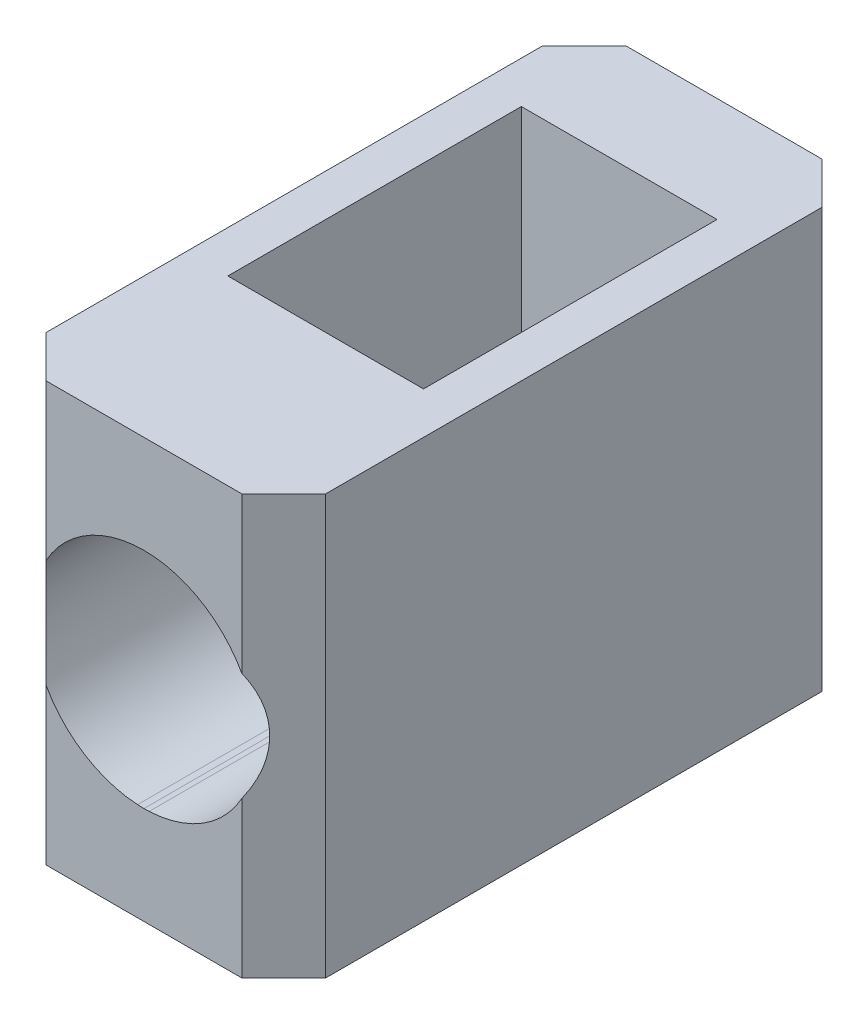
ISO-10303-21;
HEADER;
FILE_DESCRIPTION(('STEP AP214'),'2;1');
FILE_NAME('part.step','',(''),(''),'','','');
FILE_SCHEMA(('AUTOMOTIVE_DESIGN { 1 0 10303 214 1 1 1 1 }'));
ENDSEC;
DATA;
#1=APPLICATION_CONTEXT('core data for automotive mechanical design processes');
#2=APPLICATION_PROTOCOL_DEFINITION('international standard','automotive_design',2000,#1);
#3=PRODUCT_CONTEXT('',#1,'mechanical');
#4=PRODUCT('Part','Part','',(#3));
#5=PRODUCT_RELATED_PRODUCT_CATEGORY('part','',(#4));
#6=PRODUCT_DEFINITION_FORMATION('','',#4);
#7=PRODUCT_DEFINITION_CONTEXT('part definition',#1,'design');
#8=PRODUCT_DEFINITION('design','',#6,#7);
#9=PRODUCT_DEFINITION_SHAPE('','',#8);
#10=(LENGTH_UNIT() NAMED_UNIT(*) SI_UNIT(.MILLI.,.METRE.));
#11=(NAMED_UNIT(*) PLANE_ANGLE_UNIT() SI_UNIT($,.RADIAN.));
#12=(NAMED_UNIT(*) SI_UNIT($,.STERADIAN.) SOLID_ANGLE_UNIT());
#13=UNCERTAINTY_MEASURE_WITH_UNIT(LENGTH_MEASURE(1.E-05),#10,'distance_accuracy_value','');
#14=(GEOMETRIC_REPRESENTATION_CONTEXT(3) GLOBAL_UNCERTAINTY_ASSIGNED_CONTEXT((#13)) GLOBAL_UNIT_ASSIGNED_CONTEXT((#10,
#11,#12)) REPRESENTATION_CONTEXT('',''));
#15=CARTESIAN_POINT('',(0.,0.,0.));
#16=DIRECTION('',(0.,0.,1.));
#17=DIRECTION('',(1.,0.,0.));
#18=AXIS2_PLACEMENT_3D('',#15,#16,#17);
#19=CARTESIAN_POINT('',(3.99,3.05,4.7325039375));
#20=DIRECTION('',(0.,0.,-1.));
#21=DIRECTION('',(-0.0575640269595673,-0.998341816614028,0.));
#22=AXIS2_PLACEMENT_3D('',#19,#20,#21);
#23=CYLINDRICAL_SURFACE('',#22,0.8);
#24=DIRECTION('',(0.,0.,1.));
#25=VECTOR('',#24,1.);
#26=CARTESIAN_POINT('',(3.94394877843235,2.25132654670878,4.05));
#27=LINE('',#26,#25);
#28=CARTESIAN_POINT('',(3.94394877843235,2.25132654670878,3.4));
#29=VERTEX_POINT('',#28);
#30=CARTESIAN_POINT('',(3.94394877843235,2.25132654670878,4.7));
#31=VERTEX_POINT('',#30);
#32=EDGE_CURVE('E155',#29,#31,#27,.T.);
#33=ORIENTED_EDGE('',*,*,#32,.T.);
#34=CARTESIAN_POINT('',(3.99,3.05,4.7));
#35=DIRECTION('',(0.,0.,-1.));
#36=DIRECTION('',(0.,-1.,0.));
#37=AXIS2_PLACEMENT_3D('',#34,#35,#36);
#38=CIRCLE('',#37,0.8);
#39=CARTESIAN_POINT('',(3.99,2.25,4.7));
#40=VERTEX_POINT('',#39);
#41=EDGE_CURVE('E19',#40,#31,#38,.T.);
#42=ORIENTED_EDGE('',*,*,#41,.F.);
#43=DIRECTION('',(0.,0.,-1.));
#44=VECTOR('',#43,1.);
#45=CARTESIAN_POINT('',(3.99,2.25,4.7));
#46=LINE('',#45,#44);
#47=CARTESIAN_POINT('',(3.99,2.25,3.4));
#48=VERTEX_POINT('',#47);
#49=EDGE_CURVE('E157',#40,#48,#46,.T.);
#50=ORIENTED_EDGE('',*,*,#49,.T.);
#51=CARTESIAN_POINT('',(3.99,3.05,3.4));
#52=DIRECTION('',(0.,0.,-1.));
#53=DIRECTION('',(0.,-1.,0.));
#54=AXIS2_PLACEMENT_3D('',#51,#52,#53);
#55=CIRCLE('',#54,0.8);
#56=EDGE_CURVE('E152',#48,#29,#55,.T.);
#57=ORIENTED_EDGE('',*,*,#56,.T.);
#58=EDGE_LOOP('',(#33,#42,#50,#57));
#59=FACE_BOUND('',#58,.T.);
#60=ADVANCED_FACE('F16',(#59),#23,.F.);
#61=CARTESIAN_POINT('',(3.25499685,3.40947764298625,4.7));
#62=DIRECTION('',(0.,0.,1.));
#63=DIRECTION('',(1.,0.,0.));
#64=AXIS2_PLACEMENT_3D('',#61,#62,#63);
#65=PLANE('',#64);
#66=CARTESIAN_POINT('',(3.99,3.05,4.7));
#67=DIRECTION('',(0.,0.,-1.));
#68=DIRECTION('',(0.,1.,0.));
#69=AXIS2_PLACEMENT_3D('',#66,#67,#68);
#70=CIRCLE('',#69,0.8);
#71=CARTESIAN_POINT('',(3.99,3.85,4.7));
#72=VERTEX_POINT('',#71);
#73=CARTESIAN_POINT('',(4.69,3.43729833462074,4.7));
#74=VERTEX_POINT('',#73);
#75=EDGE_CURVE('E214',#72,#74,#70,.T.);
#76=ORIENTED_EDGE('',*,*,#75,.T.);
#77=DIRECTION('',(0.,1.,0.));
#78=VECTOR('',#77,1.);
#79=CARTESIAN_POINT('',(4.69,3.43729833462074,4.7));
#80=LINE('',#79,#78);
#81=CARTESIAN_POINT('',(4.69,4.55,4.7));
#82=VERTEX_POINT('',#81);
#83=EDGE_CURVE('E25',#74,#82,#80,.T.);
#84=ORIENTED_EDGE('',*,*,#83,.T.);
#85=DIRECTION('',(1.,0.,0.));
#86=VECTOR('',#85,1.);
#87=CARTESIAN_POINT('',(3.29,4.55,4.7));
#88=LINE('',#87,#86);
#89=CARTESIAN_POINT('',(3.29,4.55,4.7));
#90=VERTEX_POINT('',#89);
#91=EDGE_CURVE('E342',#90,#82,#88,.T.);
#92=ORIENTED_EDGE('',*,*,#91,.F.);
#93=DIRECTION('',(0.,-1.,0.));
#94=VECTOR('',#93,1.);
#95=CARTESIAN_POINT('',(3.29,4.55,4.7));
#96=LINE('',#95,#94);
#97=CARTESIAN_POINT('',(3.29,3.43729833462074,4.7));
#98=VERTEX_POINT('',#97);
#99=EDGE_CURVE('E11',#90,#98,#96,.T.);
#100=ORIENTED_EDGE('',*,*,#99,.T.);
#101=CARTESIAN_POINT('',(3.99,3.05,4.7));
#102=DIRECTION('',(0.,0.,-1.));
#103=DIRECTION('',(-0.875,0.484122918275922,0.));
#104=AXIS2_PLACEMENT_3D('',#101,#102,#103);
#105=CIRCLE('',#104,0.8);
#106=EDGE_CURVE('E184',#98,#72,#105,.T.);
#107=ORIENTED_EDGE('',*,*,#106,.T.);
#108=EDGE_LOOP('',(#76,#84,#92,#100,#107));
#109=FACE_BOUND('',#108,.T.);
#110=ADVANCED_FACE('F425',(#109),#65,.T.);
#111=CARTESIAN_POINT('',(3.29750222738636,4.62500315,4.70750222738636));
#112=DIRECTION('',(-0.707106781186546,0.,0.707106781186549));
#113=DIRECTION('',(0.,1.,0.));
#114=AXIS2_PLACEMENT_3D('',#111,#112,#113);
#115=PLANE('',#114);
#116=DIRECTION('',(0.,-1.,0.));
#117=VECTOR('',#116,1.);
#118=CARTESIAN_POINT('',(3.29,2.66270166537926,4.7));
#119=LINE('',#118,#117);
#120=CARTESIAN_POINT('',(3.29,2.66270166537926,4.7));
#121=VERTEX_POINT('',#120);
#122=CARTESIAN_POINT('',(3.29,1.55,4.7));
#123=VERTEX_POINT('',#122);
#124=EDGE_CURVE('E235',#121,#123,#119,.T.);
#125=ORIENTED_EDGE('',*,*,#124,.F.);
#126=CARTESIAN_POINT('',(3.29,3.43729833462074,4.7));
#127=CARTESIAN_POINT('',(3.27368895638262,3.40781788115236,4.68368895638262));
#128=CARTESIAN_POINT('',(3.25924420580558,3.37730886457919,4.66924420580558));
#129=CARTESIAN_POINT('',(3.24677795997936,3.34600844452068,4.65677795997936));
#130=CARTESIAN_POINT('',(3.23431153624368,3.31470757776467,4.64431153624368));
#131=CARTESIAN_POINT('',(3.22382627889247,3.28262193784875,4.63382627889247));
#132=CARTESIAN_POINT('',(3.21540333075852,3.25,4.62540333075852));
#133=CARTESIAN_POINT('',(3.20698028979141,3.21737770260995,4.61698028979141));
#134=CARTESIAN_POINT('',(3.2006215770086,3.18422687804306,4.6106215770086));
#135=CARTESIAN_POINT('',(3.19637624298627,3.15080343398618,4.60637624298627));
#136=CARTESIAN_POINT('',(3.19213088326533,3.11737978760453,4.60213088326532));
#137=CARTESIAN_POINT('',(3.19,3.08369211923217,4.6));
#138=CARTESIAN_POINT('',(3.19,3.05,4.6));
#139=CARTESIAN_POINT('',(3.19,3.01630788076783,4.6));
#140=CARTESIAN_POINT('',(3.19213088326533,2.98262021239547,4.60213088326532));
#141=CARTESIAN_POINT('',(3.19637624298627,2.94919656601382,4.60637624298627));
#142=CARTESIAN_POINT('',(3.2006215770086,2.91577312195694,4.6106215770086));
#143=CARTESIAN_POINT('',(3.20698028979141,2.88262229739005,4.61698028979141));
#144=CARTESIAN_POINT('',(3.21540333075852,2.85,4.62540333075852));
#145=CARTESIAN_POINT('',(3.22382627889247,2.81737806215125,4.63382627889247));
#146=CARTESIAN_POINT('',(3.23431153624368,2.78529242223533,4.64431153624368));
#147=CARTESIAN_POINT('',(3.24677795997936,2.75399155547932,4.65677795997936));
#148=CARTESIAN_POINT('',(3.25924420580558,2.72269113542081,4.66924420580558));
#149=CARTESIAN_POINT('',(3.27368895638262,2.69218211884764,4.68368895638262));
#150=CARTESIAN_POINT('',(3.29,2.66270166537926,4.7));
#151=(BOUNDED_CURVE() B_SPLINE_CURVE(3,(#126,#127,#128,#129,#130,#131,#132,#133,#134,#135,#136,
#137,#138,#139,#140,#141,#142,#143,#144,#145,#146,#147,#148,#149,#150),.UNSPECIFIED.,.F.,
.F.) B_SPLINE_CURVE_WITH_KNOTS((4,3,3,3,3,3,3,3,4),(0.,0.130884088267988,0.256904965857733,
0.37938647777126,0.5,0.620613522228739,0.743095034142267,0.869115911732012,1.),
.UNSPECIFIED.) CURVE() GEOMETRIC_REPRESENTATION_ITEM() RATIONAL_B_SPLINE_CURVE((1.,1.,1.,1.,1.,
1.,1.,1.,1.,1.,1.,1.,1.,1.,1.,1.,1.,1.,1.,1.,1.,1.,1.,1.,1.)) REPRESENTATION_ITEM(''));
#152=EDGE_CURVE('E187',#98,#121,#151,.T.);
#153=ORIENTED_EDGE('',*,*,#152,.F.);
#154=ORIENTED_EDGE('',*,*,#99,.F.);
#155=DIRECTION('',(0.707106781186549,0.,0.707106781186546));
#156=VECTOR('',#155,1.);
#157=CARTESIAN_POINT('',(2.99,4.55,4.4));
#158=LINE('',#157,#156);
#159=CARTESIAN_POINT('',(2.99,4.55,4.4));
#160=VERTEX_POINT('',#159);
#161=EDGE_CURVE('E338',#160,#90,#158,.T.);
#162=ORIENTED_EDGE('',*,*,#161,.F.);
#163=DIRECTION('',(0.,-1.,0.));
#164=VECTOR('',#163,1.);
#165=CARTESIAN_POINT('',(2.99,4.55,4.4));
#166=LINE('',#165,#164);
#167=CARTESIAN_POINT('',(2.99,1.55,4.4));
#168=VERTEX_POINT('',#167);
#169=EDGE_CURVE('E255',#160,#168,#166,.T.);
#170=ORIENTED_EDGE('',*,*,#169,.T.);
#171=DIRECTION('',(0.707106781186549,0.,0.707106781186546));
#172=VECTOR('',#171,1.);
#173=CARTESIAN_POINT('',(2.99,1.55,4.4));
#174=LINE('',#173,#172);
#175=EDGE_CURVE('E355',#168,#123,#174,.T.);
#176=ORIENTED_EDGE('',*,*,#175,.T.);
#177=EDGE_LOOP('',(#125,#153,#154,#162,#170,#176));
#178=FACE_BOUND('',#177,.T.);
#179=ADVANCED_FACE('F430',(#178),#115,.T.);
#180=CARTESIAN_POINT('',(4.68249777261364,1.47499685,4.70750222738636));
#181=DIRECTION('',(0.707106781186546,0.,0.707106781186549));
#182=DIRECTION('',(0.,-1.,0.));
#183=AXIS2_PLACEMENT_3D('',#180,#181,#182);
#184=PLANE('',#183);
#185=ORIENTED_EDGE('',*,*,#83,.F.);
#186=CARTESIAN_POINT('',(4.69,2.66270166537925,4.7));
#187=CARTESIAN_POINT('',(4.70631104361738,2.69218211884763,4.68368895638262));
#188=CARTESIAN_POINT('',(4.72075579419442,2.7226911354208,4.66924420580558));
#189=CARTESIAN_POINT('',(4.73322204002064,2.75399155547931,4.65677795997936));
#190=CARTESIAN_POINT('',(4.74568846375632,2.78529242223532,4.64431153624368));
#191=CARTESIAN_POINT('',(4.75617372110753,2.81737806215124,4.63382627889246));
#192=CARTESIAN_POINT('',(4.76459666924148,2.85,4.62540333075851));
#193=CARTESIAN_POINT('',(4.7730197102086,2.88262229739004,4.6169802897914));
#194=CARTESIAN_POINT('',(4.7793784229914,2.91577312195693,4.61062157700859));
#195=CARTESIAN_POINT('',(4.78362375701373,2.94919656601381,4.60637624298626));
#196=CARTESIAN_POINT('',(4.78786911673468,2.98262021239546,4.60213088326532));
#197=CARTESIAN_POINT('',(4.79,3.01630788076783,4.6));
#198=CARTESIAN_POINT('',(4.79,3.05,4.6));
#199=CARTESIAN_POINT('',(4.79,3.08369211923216,4.6));
#200=CARTESIAN_POINT('',(4.78786911673468,3.11737978760454,4.60213088326532));
#201=CARTESIAN_POINT('',(4.78362375701373,3.15080343398618,4.60637624298626));
#202=CARTESIAN_POINT('',(4.7793784229914,3.18422687804306,4.61062157700859));
#203=CARTESIAN_POINT('',(4.7730197102086,3.21737770260995,4.6169802897914));
#204=CARTESIAN_POINT('',(4.76459666924148,3.25,4.62540333075851));
#205=CARTESIAN_POINT('',(4.75617372110754,3.28262193784875,4.63382627889246));
#206=CARTESIAN_POINT('',(4.74568846375632,3.31470757776468,4.64431153624367));
#207=CARTESIAN_POINT('',(4.73322204002064,3.34600844452069,4.65677795997936));
#208=CARTESIAN_POINT('',(4.72075579419442,3.37730886457919,4.66924420580558));
#209=CARTESIAN_POINT('',(4.70631104361738,3.40781788115236,4.68368895638261));
#210=CARTESIAN_POINT('',(4.69,3.43729833462074,4.7));
#211=(BOUNDED_CURVE() B_SPLINE_CURVE(3,(#186,#187,#188,#189,#190,#191,#192,#193,#194,#195,#196,
#197,#198,#199,#200,#201,#202,#203,#204,#205,#206,#207,#208,#209,#210),.UNSPECIFIED.,.F.,
.F.) B_SPLINE_CURVE_WITH_KNOTS((4,3,3,3,3,3,3,3,4),(0.,0.130884088267987,0.256904965857733,
0.379386477771262,0.5,0.620613522228739,0.743095034142267,0.869115911732011,1.),
.UNSPECIFIED.) CURVE() GEOMETRIC_REPRESENTATION_ITEM() RATIONAL_B_SPLINE_CURVE((1.,1.,1.,1.,1.,
1.,1.,1.,1.,1.,1.,1.,1.,1.,1.,1.,1.,1.,1.,1.,1.,1.,1.,1.,1.)) REPRESENTATION_ITEM(''));
#212=CARTESIAN_POINT('',(4.69,2.66270166537925,4.7));
#213=VERTEX_POINT('',#212);
#214=EDGE_CURVE('E221',#213,#74,#211,.T.);
#215=ORIENTED_EDGE('',*,*,#214,.F.);
#216=DIRECTION('',(0.,1.,0.));
#217=VECTOR('',#216,1.);
#218=CARTESIAN_POINT('',(4.69,1.55,4.7));
#219=LINE('',#218,#217);
#220=CARTESIAN_POINT('',(4.69,1.55,4.7));
#221=VERTEX_POINT('',#220);
#222=EDGE_CURVE('E259',#221,#213,#219,.T.);
#223=ORIENTED_EDGE('',*,*,#222,.F.);
#224=DIRECTION('',(0.707106781186549,0.,-0.707106781186546));
#225=VECTOR('',#224,1.);
#226=CARTESIAN_POINT('',(4.69,1.55,4.7));
#227=LINE('',#226,#225);
#228=CARTESIAN_POINT('',(4.99,1.55,4.4));
#229=VERTEX_POINT('',#228);
#230=EDGE_CURVE('E379',#221,#229,#227,.T.);
#231=ORIENTED_EDGE('',*,*,#230,.T.);
#232=DIRECTION('',(0.,1.,0.));
#233=VECTOR('',#232,1.);
#234=CARTESIAN_POINT('',(4.99,1.55,4.4));
#235=LINE('',#234,#233);
#236=CARTESIAN_POINT('',(4.99,4.55,4.4));
#237=VERTEX_POINT('',#236);
#238=EDGE_CURVE('E40',#229,#237,#235,.T.);
#239=ORIENTED_EDGE('',*,*,#238,.T.);
#240=DIRECTION('',(0.707106781186549,0.,-0.707106781186546));
#241=VECTOR('',#240,1.);
#242=CARTESIAN_POINT('',(4.69,4.55,4.7));
#243=LINE('',#242,#241);
#244=EDGE_CURVE('E346',#82,#237,#243,.T.);
#245=ORIENTED_EDGE('',*,*,#244,.F.);
#246=EDGE_LOOP('',(#185,#215,#223,#231,#239,#245));
#247=FACE_BOUND('',#246,.T.);
#248=ADVANCED_FACE('F436',(#247),#184,.T.);
#249=CARTESIAN_POINT('',(4.68249777261364,4.62500315,0.542497772613639));
#250=DIRECTION('',(0.707106781186548,0.,-0.707106781186547));
#251=DIRECTION('',(0.,-1.,0.));
#252=AXIS2_PLACEMENT_3D('',#249,#250,#251);
#253=PLANE('',#252);
#254=DIRECTION('',(0.,-1.,0.));
#255=VECTOR('',#254,1.);
#256=CARTESIAN_POINT('',(4.69,4.55,0.55));
#257=LINE('',#256,#255);
#258=CARTESIAN_POINT('',(4.69,4.55,0.55));
#259=VERTEX_POINT('',#258);
#260=CARTESIAN_POINT('',(4.69,1.55,0.55));
#261=VERTEX_POINT('',#260);
#262=EDGE_CURVE('E251',#259,#261,#257,.T.);
#263=ORIENTED_EDGE('',*,*,#262,.F.);
#264=DIRECTION('',(-0.707106781186547,0.,-0.707106781186548));
#265=VECTOR('',#264,1.);
#266=CARTESIAN_POINT('',(4.99,4.55,0.85));
#267=LINE('',#266,#265);
#268=CARTESIAN_POINT('',(4.99,4.55,0.85));
#269=VERTEX_POINT('',#268);
#270=EDGE_CURVE('E322',#269,#259,#267,.T.);
#271=ORIENTED_EDGE('',*,*,#270,.F.);
#272=DIRECTION('',(0.,-1.,0.));
#273=VECTOR('',#272,1.);
#274=CARTESIAN_POINT('',(4.99,4.55,0.85));
#275=LINE('',#274,#273);
#276=CARTESIAN_POINT('',(4.99,1.55,0.85));
#277=VERTEX_POINT('',#276);
#278=EDGE_CURVE('E229',#269,#277,#275,.T.);
#279=ORIENTED_EDGE('',*,*,#278,.T.);
#280=DIRECTION('',(-0.707106781186547,0.,-0.707106781186548));
#281=VECTOR('',#280,1.);
#282=CARTESIAN_POINT('',(4.99,1.55,0.85));
#283=LINE('',#282,#281);
#284=EDGE_CURVE('E371',#277,#261,#283,.T.);
#285=ORIENTED_EDGE('',*,*,#284,.T.);
#286=EDGE_LOOP('',(#263,#271,#279,#285));
#287=FACE_BOUND('',#286,.T.);
#288=ADVANCED_FACE('F455',(#287),#253,.T.);
#289=CARTESIAN_POINT('',(2.98249777261364,4.62500315,0.857502227386361));
#290=DIRECTION('',(-0.707106781186547,0.,-0.707106781186549));
#291=DIRECTION('',(-0.707106781186549,0.,0.707106781186547));
#292=AXIS2_PLACEMENT_3D('',#289,#290,#291);
#293=PLANE('',#292);
#294=DIRECTION('',(0.,-1.,0.));
#295=VECTOR('',#294,1.);
#296=CARTESIAN_POINT('',(2.99,4.55,0.85));
#297=LINE('',#296,#295);
#298=CARTESIAN_POINT('',(2.99,4.55,0.85));
#299=VERTEX_POINT('',#298);
#300=CARTESIAN_POINT('',(2.99,1.55,0.85));
#301=VERTEX_POINT('',#300);
#302=EDGE_CURVE('E382',#299,#301,#297,.T.);
#303=ORIENTED_EDGE('',*,*,#302,.F.);
#304=DIRECTION('',(-0.707106781186549,0.,0.707106781186546));
#305=VECTOR('',#304,1.);
#306=CARTESIAN_POINT('',(3.29,4.55,0.55));
#307=LINE('',#306,#305);
#308=CARTESIAN_POINT('',(3.29,4.55,0.55));
#309=VERTEX_POINT('',#308);
#310=EDGE_CURVE('E330',#309,#299,#307,.T.);
#311=ORIENTED_EDGE('',*,*,#310,.F.);
#312=DIRECTION('',(0.,-1.,0.));
#313=VECTOR('',#312,1.);
#314=CARTESIAN_POINT('',(3.29,4.55,0.55));
#315=LINE('',#314,#313);
#316=CARTESIAN_POINT('',(3.29,1.55,0.55));
#317=VERTEX_POINT('',#316);
#318=EDGE_CURVE('E254',#309,#317,#315,.T.);
#319=ORIENTED_EDGE('',*,*,#318,.T.);
#320=DIRECTION('',(-0.707106781186549,0.,0.707106781186546));
#321=VECTOR('',#320,1.);
#322=CARTESIAN_POINT('',(3.29,1.55,0.55));
#323=LINE('',#322,#321);
#324=EDGE_CURVE('E363',#317,#301,#323,.T.);
#325=ORIENTED_EDGE('',*,*,#324,.T.);
#326=EDGE_LOOP('',(#303,#311,#319,#325));
#327=FACE_BOUND('',#326,.T.);
#328=ADVANCED_FACE('F448',(#327),#293,.T.);
#329=CARTESIAN_POINT('',(3.25499685,1.52217930836552,4.7));
#330=DIRECTION('',(0.,0.,1.));
#331=DIRECTION('',(1.,0.,0.));
#332=AXIS2_PLACEMENT_3D('',#329,#330,#331);
#333=PLANE('',#332);
#334=ORIENTED_EDGE('',*,*,#124,.T.);
#335=DIRECTION('',(1.,0.,0.));
#336=VECTOR('',#335,1.);
#337=CARTESIAN_POINT('',(3.29,1.55,4.7));
#338=LINE('',#337,#336);
#339=EDGE_CURVE('E272',#123,#221,#338,.T.);
#340=ORIENTED_EDGE('',*,*,#339,.T.);
#341=ORIENTED_EDGE('',*,*,#222,.T.);
#342=CARTESIAN_POINT('',(3.99,3.05,4.7));
#343=DIRECTION('',(0.,0.,-1.));
#344=DIRECTION('',(0.875,-0.484122918275934,0.));
#345=AXIS2_PLACEMENT_3D('',#342,#343,#344);
#346=CIRCLE('',#345,0.8);
#347=CARTESIAN_POINT('',(4.02697386727435,2.25085487354375,4.7));
#348=VERTEX_POINT('',#347);
#349=EDGE_CURVE('E217',#213,#348,#346,.T.);
#350=ORIENTED_EDGE('',*,*,#349,.T.);
#351=CARTESIAN_POINT('',(3.99,3.05,4.7));
#352=DIRECTION('',(0.,0.,-1.));
#353=DIRECTION('',(0.875,-0.484122918275934,0.));
#354=AXIS2_PLACEMENT_3D('',#351,#352,#353);
#355=CIRCLE('',#354,0.8);
#356=EDGE_CURVE('E291',#348,#40,#355,.T.);
#357=ORIENTED_EDGE('',*,*,#356,.T.);
#358=ORIENTED_EDGE('',*,*,#41,.T.);
#359=CARTESIAN_POINT('',(3.99,3.05,4.7));
#360=DIRECTION('',(0.,0.,-1.));
#361=DIRECTION('',(0.,-1.,0.));
#362=AXIS2_PLACEMENT_3D('',#359,#360,#361);
#363=CIRCLE('',#362,0.8);
#364=EDGE_CURVE('E181',#31,#121,#363,.T.);
#365=ORIENTED_EDGE('',*,*,#364,.T.);
#366=EDGE_LOOP('',(#334,#340,#341,#350,#357,#358,#365));
#367=FACE_BOUND('',#366,.T.);
#368=ADVANCED_FACE('F394',(#367),#333,.T.);
#369=CARTESIAN_POINT('',(4.99,1.47499685,4.48875315));
#370=DIRECTION('',(1.,0.,0.));
#371=DIRECTION('',(0.,0.,1.));
#372=AXIS2_PLACEMENT_3D('',#369,#370,#371);
#373=PLANE('',#372);
#374=ORIENTED_EDGE('',*,*,#238,.F.);
#375=DIRECTION('',(0.,0.,1.));
#376=VECTOR('',#375,1.);
#377=CARTESIAN_POINT('',(4.99,1.55,0.85));
#378=LINE('',#377,#376);
#379=EDGE_CURVE('E375',#277,#229,#378,.T.);
#380=ORIENTED_EDGE('',*,*,#379,.F.);
#381=ORIENTED_EDGE('',*,*,#278,.F.);
#382=DIRECTION('',(0.,0.,1.));
#383=VECTOR('',#382,1.);
#384=CARTESIAN_POINT('',(4.99,4.55,0.85));
#385=LINE('',#384,#383);
#386=EDGE_CURVE('E319',#269,#237,#385,.T.);
#387=ORIENTED_EDGE('',*,*,#386,.T.);
#388=EDGE_LOOP('',(#374,#380,#381,#387));
#389=FACE_BOUND('',#388,.T.);
#390=ADVANCED_FACE('F456',(#389),#373,.T.);
#391=CARTESIAN_POINT('',(3.99,3.05,4.7325039375));
#392=DIRECTION('',(0.,0.,-1.));
#393=DIRECTION('',(-0.0462173340929392,0.998931408070315,0.));
#394=AXIS2_PLACEMENT_3D('',#391,#392,#393);
#395=CYLINDRICAL_SURFACE('',#394,0.8);
#396=DIRECTION('',(0.,0.,-1.));
#397=VECTOR('',#396,1.);
#398=CARTESIAN_POINT('',(4.02697386727435,2.25085487354375,4.05));
#399=LINE('',#398,#397);
#400=CARTESIAN_POINT('',(4.02697386727435,2.25085487354375,3.4));
#401=VERTEX_POINT('',#400);
#402=EDGE_CURVE('E202',#348,#401,#399,.T.);
#403=ORIENTED_EDGE('',*,*,#402,.T.);
#404=CARTESIAN_POINT('',(3.99,3.05,3.4));
#405=DIRECTION('',(0.,0.,-1.));
#406=DIRECTION('',(0.875,-0.484122918275927,0.));
#407=AXIS2_PLACEMENT_3D('',#404,#405,#406);
#408=CIRCLE('',#407,0.8);
#409=EDGE_CURVE('E161',#401,#48,#408,.T.);
#410=ORIENTED_EDGE('',*,*,#409,.T.);
#411=ORIENTED_EDGE('',*,*,#49,.F.);
#412=ORIENTED_EDGE('',*,*,#356,.F.);
#413=EDGE_LOOP('',(#403,#410,#411,#412));
#414=FACE_BOUND('',#413,.T.);
#415=ADVANCED_FACE('F398',(#414),#395,.F.);
#416=CARTESIAN_POINT('',(4.72500315,1.47499685,0.55));
#417=DIRECTION('',(0.,0.,-1.));
#418=DIRECTION('',(0.,-1.,0.));
#419=AXIS2_PLACEMENT_3D('',#416,#417,#418);
#420=PLANE('',#419);
#421=ORIENTED_EDGE('',*,*,#262,.T.);
#422=DIRECTION('',(1.,0.,0.));
#423=VECTOR('',#422,1.);
#424=CARTESIAN_POINT('',(3.29,1.55,0.55));
#425=LINE('',#424,#423);
#426=EDGE_CURVE('E367',#317,#261,#425,.T.);
#427=ORIENTED_EDGE('',*,*,#426,.F.);
#428=ORIENTED_EDGE('',*,*,#318,.F.);
#429=DIRECTION('',(1.,0.,0.));
#430=VECTOR('',#429,1.);
#431=CARTESIAN_POINT('',(3.29,4.55,0.55));
#432=LINE('',#431,#430);
#433=EDGE_CURVE('E326',#309,#259,#432,.T.);
#434=ORIENTED_EDGE('',*,*,#433,.T.);
#435=EDGE_LOOP('',(#421,#427,#428,#434));
#436=FACE_BOUND('',#435,.T.);
#437=ADVANCED_FACE('F452',(#436),#420,.T.);
#438=CARTESIAN_POINT('',(2.99,1.47499685,0.76124685));
#439=DIRECTION('',(-1.,0.,0.));
#440=DIRECTION('',(0.,0.,1.));
#441=AXIS2_PLACEMENT_3D('',#438,#439,#440);
#442=PLANE('',#441);
#443=ORIENTED_EDGE('',*,*,#302,.T.);
#444=DIRECTION('',(0.,0.,-1.));
#445=VECTOR('',#444,1.);
#446=CARTESIAN_POINT('',(2.99,1.55,4.4));
#447=LINE('',#446,#445);
#448=EDGE_CURVE('E359',#168,#301,#447,.T.);
#449=ORIENTED_EDGE('',*,*,#448,.F.);
#450=ORIENTED_EDGE('',*,*,#169,.F.);
#451=DIRECTION('',(0.,0.,-1.));
#452=VECTOR('',#451,1.);
#453=CARTESIAN_POINT('',(2.99,4.55,4.4));
#454=LINE('',#453,#452);
#455=EDGE_CURVE('E334',#160,#299,#454,.T.);
#456=ORIENTED_EDGE('',*,*,#455,.T.);
#457=EDGE_LOOP('',(#443,#449,#450,#456));
#458=FACE_BOUND('',#457,.T.);
#459=ADVANCED_FACE('F444',(#458),#442,.T.);
#460=CARTESIAN_POINT('',(2.93999685,1.55,0.44624685));
#461=DIRECTION('',(0.,-1.,0.));
#462=DIRECTION('',(0.,0.,-1.));
#463=AXIS2_PLACEMENT_3D('',#460,#461,#462);
#464=PLANE('',#463);
#465=DIRECTION('',(1.,0.,0.));
#466=VECTOR('',#465,1.);
#467=CARTESIAN_POINT('',(3.29,1.55,1.3));
#468=LINE('',#467,#466);
#469=CARTESIAN_POINT('',(3.29,1.55,1.3));
#470=VERTEX_POINT('',#469);
#471=CARTESIAN_POINT('',(4.69,1.55,1.3));
#472=VERTEX_POINT('',#471);
#473=EDGE_CURVE('E269',#470,#472,#468,.T.);
#474=ORIENTED_EDGE('',*,*,#473,.F.);
#475=DIRECTION('',(0.,0.,1.));
#476=VECTOR('',#475,1.);
#477=CARTESIAN_POINT('',(3.29,1.55,1.3));
#478=LINE('',#477,#476);
#479=CARTESIAN_POINT('',(3.29,1.55,3.4));
#480=VERTEX_POINT('',#479);
#481=EDGE_CURVE('E277',#470,#480,#478,.T.);
#482=ORIENTED_EDGE('',*,*,#481,.T.);
#483=DIRECTION('',(1.,0.,0.));
#484=VECTOR('',#483,1.);
#485=CARTESIAN_POINT('',(3.29,1.55,3.4));
#486=LINE('',#485,#484);
#487=CARTESIAN_POINT('',(4.69,1.55,3.4));
#488=VERTEX_POINT('',#487);
#489=EDGE_CURVE('E240',#480,#488,#486,.T.);
#490=ORIENTED_EDGE('',*,*,#489,.T.);
#491=DIRECTION('',(0.,0.,-1.));
#492=VECTOR('',#491,1.);
#493=CARTESIAN_POINT('',(4.69,1.55,3.4));
#494=LINE('',#493,#492);
#495=EDGE_CURVE('E307',#488,#472,#494,.T.);
#496=ORIENTED_EDGE('',*,*,#495,.T.);
#497=EDGE_LOOP('',(#474,#482,#490,#496));
#498=FACE_BOUND('',#497,.T.);
#499=ORIENTED_EDGE('',*,*,#339,.F.);
#500=ORIENTED_EDGE('',*,*,#175,.F.);
#501=ORIENTED_EDGE('',*,*,#448,.T.);
#502=ORIENTED_EDGE('',*,*,#324,.F.);
#503=ORIENTED_EDGE('',*,*,#426,.T.);
#504=ORIENTED_EDGE('',*,*,#284,.F.);
#505=ORIENTED_EDGE('',*,*,#379,.T.);
#506=ORIENTED_EDGE('',*,*,#230,.F.);
#507=EDGE_LOOP('',(#499,#500,#501,#502,#503,#504,#505,#506));
#508=FACE_BOUND('',#507,.T.);
#509=ADVANCED_FACE('F409',(#498,#508),#464,.T.);
#510=CARTESIAN_POINT('',(3.25499685,1.47499685,1.3));
#511=DIRECTION('',(0.,0.,1.));
#512=DIRECTION('',(1.,0.,0.));
#513=AXIS2_PLACEMENT_3D('',#510,#511,#512);
#514=PLANE('',#513);
#515=DIRECTION('',(0.,-1.,0.));
#516=VECTOR('',#515,1.);
#517=CARTESIAN_POINT('',(4.69,4.55,1.3));
#518=LINE('',#517,#516);
#519=CARTESIAN_POINT('',(4.69,4.55,1.3));
#520=VERTEX_POINT('',#519);
#521=EDGE_CURVE('E315',#520,#472,#518,.T.);
#522=ORIENTED_EDGE('',*,*,#521,.F.);
#523=DIRECTION('',(1.,0.,0.));
#524=VECTOR('',#523,1.);
#525=CARTESIAN_POINT('',(3.29,4.55,1.3));
#526=LINE('',#525,#524);
#527=CARTESIAN_POINT('',(3.29,4.55,1.3));
#528=VERTEX_POINT('',#527);
#529=EDGE_CURVE('E273',#528,#520,#526,.T.);
#530=ORIENTED_EDGE('',*,*,#529,.F.);
#531=DIRECTION('',(0.,-1.,0.));
#532=VECTOR('',#531,1.);
#533=CARTESIAN_POINT('',(3.29,4.55,1.3));
#534=LINE('',#533,#532);
#535=EDGE_CURVE('E280',#528,#470,#534,.T.);
#536=ORIENTED_EDGE('',*,*,#535,.T.);
#537=ORIENTED_EDGE('',*,*,#473,.T.);
#538=EDGE_LOOP('',(#522,#530,#536,#537));
#539=FACE_BOUND('',#538,.T.);
#540=ADVANCED_FACE('F484',(#539),#514,.T.);
#541=CARTESIAN_POINT('',(2.93999685,4.55,0.44624685));
#542=DIRECTION('',(0.,-1.,0.));
#543=DIRECTION('',(0.,0.,-1.));
#544=AXIS2_PLACEMENT_3D('',#541,#542,#543);
#545=PLANE('',#544);
#546=DIRECTION('',(0.,0.,1.));
#547=VECTOR('',#546,1.);
#548=CARTESIAN_POINT('',(3.29,4.55,1.3));
#549=LINE('',#548,#547);
#550=CARTESIAN_POINT('',(3.29,4.55,3.4));
#551=VERTEX_POINT('',#550);
#552=EDGE_CURVE('E284',#528,#551,#549,.T.);
#553=ORIENTED_EDGE('',*,*,#552,.F.);
#554=ORIENTED_EDGE('',*,*,#529,.T.);
#555=DIRECTION('',(0.,0.,-1.));
#556=VECTOR('',#555,1.);
#557=CARTESIAN_POINT('',(4.69,4.55,3.4));
#558=LINE('',#557,#556);
#559=CARTESIAN_POINT('',(4.69,4.55,3.4));
#560=VERTEX_POINT('',#559);
#561=EDGE_CURVE('E311',#560,#520,#558,.T.);
#562=ORIENTED_EDGE('',*,*,#561,.F.);
#563=DIRECTION('',(1.,0.,0.));
#564=VECTOR('',#563,1.);
#565=CARTESIAN_POINT('',(3.29,4.55,3.4));
#566=LINE('',#565,#564);
#567=EDGE_CURVE('E294',#551,#560,#566,.T.);
#568=ORIENTED_EDGE('',*,*,#567,.F.);
#569=EDGE_LOOP('',(#553,#554,#562,#568));
#570=FACE_BOUND('',#569,.T.);
#571=ORIENTED_EDGE('',*,*,#386,.F.);
#572=ORIENTED_EDGE('',*,*,#270,.T.);
#573=ORIENTED_EDGE('',*,*,#433,.F.);
#574=ORIENTED_EDGE('',*,*,#310,.T.);
#575=ORIENTED_EDGE('',*,*,#455,.F.);
#576=ORIENTED_EDGE('',*,*,#161,.T.);
#577=ORIENTED_EDGE('',*,*,#91,.T.);
#578=ORIENTED_EDGE('',*,*,#244,.T.);
#579=EDGE_LOOP('',(#571,#572,#573,#574,#575,#576,#577,#578));
#580=FACE_BOUND('',#579,.T.);
#581=ADVANCED_FACE('F440',(#570,#580),#545,.F.);
#582=CARTESIAN_POINT('',(4.69,1.47499685,1.24749685));
#583=DIRECTION('',(-1.,0.,0.));
#584=DIRECTION('',(0.,0.,1.));
#585=AXIS2_PLACEMENT_3D('',#582,#583,#584);
#586=PLANE('',#585);
#587=ORIENTED_EDGE('',*,*,#495,.F.);
#588=DIRECTION('',(0.,1.,0.));
#589=VECTOR('',#588,1.);
#590=CARTESIAN_POINT('',(4.69,1.55,3.4));
#591=LINE('',#590,#589);
#592=CARTESIAN_POINT('',(4.69,2.66270166537926,3.4));
#593=VERTEX_POINT('',#592);
#594=EDGE_CURVE('E236',#488,#593,#591,.T.);
#595=ORIENTED_EDGE('',*,*,#594,.T.);
#596=DIRECTION('',(0.,-1.,0.));
#597=VECTOR('',#596,1.);
#598=CARTESIAN_POINT('',(4.69,3.43729833462074,3.4));
#599=LINE('',#598,#597);
#600=CARTESIAN_POINT('',(4.69,3.43729833462074,3.4));
#601=VERTEX_POINT('',#600);
#602=EDGE_CURVE('E304',#601,#593,#599,.T.);
#603=ORIENTED_EDGE('',*,*,#602,.F.);
#604=DIRECTION('',(0.,-1.,0.));
#605=VECTOR('',#604,1.);
#606=CARTESIAN_POINT('',(4.69,4.55,3.4));
#607=LINE('',#606,#605);
#608=EDGE_CURVE('E298',#560,#601,#607,.T.);
#609=ORIENTED_EDGE('',*,*,#608,.F.);
#610=ORIENTED_EDGE('',*,*,#561,.T.);
#611=ORIENTED_EDGE('',*,*,#521,.T.);
#612=EDGE_LOOP('',(#587,#595,#603,#609,#610,#611));
#613=FACE_BOUND('',#612,.T.);
#614=ADVANCED_FACE('F407',(#613),#586,.T.);
#615=CARTESIAN_POINT('',(4.95428571428572,2.58524199845511,3.4));
#616=DIRECTION('',(0.,0.,-1.));
#617=DIRECTION('',(0.,-1.,0.));
#618=AXIS2_PLACEMENT_3D('',#615,#616,#617);
#619=PLANE('',#618);
#620=ORIENTED_EDGE('',*,*,#602,.T.);
#621=CARTESIAN_POINT('',(3.99,3.05,3.4));
#622=DIRECTION('',(0.,0.,-1.));
#623=DIRECTION('',(0.875,0.484122918275928,0.));
#624=AXIS2_PLACEMENT_3D('',#621,#622,#623);
#625=CIRCLE('',#624,0.8);
#626=EDGE_CURVE('E213',#601,#593,#625,.T.);
#627=ORIENTED_EDGE('',*,*,#626,.F.);
#628=EDGE_LOOP('',(#620,#627));
#629=FACE_BOUND('',#628,.T.);
#630=ADVANCED_FACE('F404',(#629),#619,.F.);
#631=CARTESIAN_POINT('',(3.34,2.58524199845511,3.4));
#632=DIRECTION('',(0.,0.,-1.));
#633=DIRECTION('',(0.,-1.,0.));
#634=AXIS2_PLACEMENT_3D('',#631,#632,#633);
#635=PLANE('',#634);
#636=DIRECTION('',(0.,1.,0.));
#637=VECTOR('',#636,1.);
#638=CARTESIAN_POINT('',(3.29,2.66270166537926,3.4));
#639=LINE('',#638,#637);
#640=CARTESIAN_POINT('',(3.29,2.66270166537926,3.4));
#641=VERTEX_POINT('',#640);
#642=CARTESIAN_POINT('',(3.29,3.43729833462074,3.4));
#643=VERTEX_POINT('',#642);
#644=EDGE_CURVE('E268',#641,#643,#639,.T.);
#645=ORIENTED_EDGE('',*,*,#644,.T.);
#646=CARTESIAN_POINT('',(3.99,3.05,3.4));
#647=DIRECTION('',(0.,0.,-1.));
#648=DIRECTION('',(-0.875,-0.484122918275923,0.));
#649=AXIS2_PLACEMENT_3D('',#646,#647,#648);
#650=CIRCLE('',#649,0.8);
#651=EDGE_CURVE('E175',#641,#643,#650,.T.);
#652=ORIENTED_EDGE('',*,*,#651,.F.);
#653=EDGE_LOOP('',(#645,#652));
#654=FACE_BOUND('',#653,.T.);
#655=ADVANCED_FACE('F418',(#654),#635,.F.);
#656=CARTESIAN_POINT('',(4.72500315,3.40947764298625,3.4));
#657=DIRECTION('',(0.,0.,-1.));
#658=DIRECTION('',(0.,-1.,0.));
#659=AXIS2_PLACEMENT_3D('',#656,#657,#658);
#660=PLANE('',#659);
#661=DIRECTION('',(0.,-1.,0.));
#662=VECTOR('',#661,1.);
#663=CARTESIAN_POINT('',(3.29,4.55,3.4));
#664=LINE('',#663,#662);
#665=EDGE_CURVE('E288',#551,#643,#664,.T.);
#666=ORIENTED_EDGE('',*,*,#665,.F.);
#667=ORIENTED_EDGE('',*,*,#567,.T.);
#668=ORIENTED_EDGE('',*,*,#608,.T.);
#669=CARTESIAN_POINT('',(3.99,3.05,3.4));
#670=DIRECTION('',(0.,0.,-1.));
#671=DIRECTION('',(0.,1.,0.));
#672=AXIS2_PLACEMENT_3D('',#669,#670,#671);
#673=CIRCLE('',#672,0.8);
#674=CARTESIAN_POINT('',(3.99,3.85,3.4));
#675=VERTEX_POINT('',#674);
#676=EDGE_CURVE('E209',#675,#601,#673,.T.);
#677=ORIENTED_EDGE('',*,*,#676,.F.);
#678=CARTESIAN_POINT('',(3.99,3.05,3.4));
#679=DIRECTION('',(0.,0.,-1.));
#680=DIRECTION('',(-0.875,0.484122918275923,0.));
#681=AXIS2_PLACEMENT_3D('',#678,#679,#680);
#682=CIRCLE('',#681,0.8);
#683=EDGE_CURVE('E199',#643,#675,#682,.T.);
#684=ORIENTED_EDGE('',*,*,#683,.F.);
#685=EDGE_LOOP('',(#666,#667,#668,#677,#684));
#686=FACE_BOUND('',#685,.T.);
#687=ADVANCED_FACE('F420',(#686),#660,.T.);
#688=CARTESIAN_POINT('',(3.29,1.47499685,3.45250315));
#689=DIRECTION('',(1.,0.,0.));
#690=DIRECTION('',(0.,1.,0.));
#691=AXIS2_PLACEMENT_3D('',#688,#689,#690);
#692=PLANE('',#691);
#693=ORIENTED_EDGE('',*,*,#644,.F.);
#694=DIRECTION('',(0.,1.,0.));
#695=VECTOR('',#694,1.);
#696=CARTESIAN_POINT('',(3.29,1.55,3.4));
#697=LINE('',#696,#695);
#698=EDGE_CURVE('E162',#480,#641,#697,.T.);
#699=ORIENTED_EDGE('',*,*,#698,.F.);
#700=ORIENTED_EDGE('',*,*,#481,.F.);
#701=ORIENTED_EDGE('',*,*,#535,.F.);
#702=ORIENTED_EDGE('',*,*,#552,.T.);
#703=ORIENTED_EDGE('',*,*,#665,.T.);
#704=EDGE_LOOP('',(#693,#699,#700,#701,#702,#703));
#705=FACE_BOUND('',#704,.T.);
#706=ADVANCED_FACE('F414',(#705),#692,.T.);
#707=CARTESIAN_POINT('',(4.72500315,1.52217930836552,3.4));
#708=DIRECTION('',(0.,0.,-1.));
#709=DIRECTION('',(0.,-1.,0.));
#710=AXIS2_PLACEMENT_3D('',#707,#708,#709);
#711=PLANE('',#710);
#712=ORIENTED_EDGE('',*,*,#594,.F.);
#713=ORIENTED_EDGE('',*,*,#489,.F.);
#714=ORIENTED_EDGE('',*,*,#698,.T.);
#715=CARTESIAN_POINT('',(3.99,3.05,3.4));
#716=DIRECTION('',(0.,0.,-1.));
#717=DIRECTION('',(0.,-1.,0.));
#718=AXIS2_PLACEMENT_3D('',#715,#716,#717);
#719=CIRCLE('',#718,0.8);
#720=EDGE_CURVE('E166',#29,#641,#719,.T.);
#721=ORIENTED_EDGE('',*,*,#720,.F.);
#722=ORIENTED_EDGE('',*,*,#56,.F.);
#723=ORIENTED_EDGE('',*,*,#409,.F.);
#724=CARTESIAN_POINT('',(3.99,3.05,3.4));
#725=DIRECTION('',(0.,0.,-1.));
#726=DIRECTION('',(0.875,-0.484122918275927,0.));
#727=AXIS2_PLACEMENT_3D('',#724,#725,#726);
#728=CIRCLE('',#727,0.8);
#729=EDGE_CURVE('E241',#593,#401,#728,.T.);
#730=ORIENTED_EDGE('',*,*,#729,.F.);
#731=EDGE_LOOP('',(#712,#713,#714,#721,#722,#723,#730));
#732=FACE_BOUND('',#731,.T.);
#733=ADVANCED_FACE('F168',(#732),#711,.T.);
#734=CARTESIAN_POINT('',(3.99,3.05,4.7325039375));
#735=DIRECTION('',(0.,0.,-1.));
#736=DIRECTION('',(-0.0462173340929392,0.998931408070315,0.));
#737=AXIS2_PLACEMENT_3D('',#734,#735,#736);
#738=CYLINDRICAL_SURFACE('',#737,0.8);
#739=ORIENTED_EDGE('',*,*,#402,.F.);
#740=ORIENTED_EDGE('',*,*,#349,.F.);
#741=ORIENTED_EDGE('',*,*,#214,.T.);
#742=ORIENTED_EDGE('',*,*,#75,.F.);
#743=DIRECTION('',(0.,0.,-1.));
#744=VECTOR('',#743,1.);
#745=CARTESIAN_POINT('',(3.99,3.85,4.7));
#746=LINE('',#745,#744);
#747=EDGE_CURVE('E188',#72,#675,#746,.T.);
#748=ORIENTED_EDGE('',*,*,#747,.T.);
#749=ORIENTED_EDGE('',*,*,#676,.T.);
#750=ORIENTED_EDGE('',*,*,#626,.T.);
#751=ORIENTED_EDGE('',*,*,#729,.T.);
#752=EDGE_LOOP('',(#739,#740,#741,#742,#748,#749,#750,#751));
#753=FACE_BOUND('',#752,.T.);
#754=ADVANCED_FACE('F401',(#753),#738,.F.);
#755=CARTESIAN_POINT('',(3.99,3.05,4.7325039375));
#756=DIRECTION('',(0.,0.,-1.));
#757=DIRECTION('',(-0.0575640269595673,-0.998341816614028,0.));
#758=AXIS2_PLACEMENT_3D('',#755,#756,#757);
#759=CYLINDRICAL_SURFACE('',#758,0.8);
#760=ORIENTED_EDGE('',*,*,#32,.F.);
#761=ORIENTED_EDGE('',*,*,#720,.T.);
#762=ORIENTED_EDGE('',*,*,#651,.T.);
#763=ORIENTED_EDGE('',*,*,#683,.T.);
#764=ORIENTED_EDGE('',*,*,#747,.F.);
#765=ORIENTED_EDGE('',*,*,#106,.F.);
#766=ORIENTED_EDGE('',*,*,#152,.T.);
#767=ORIENTED_EDGE('',*,*,#364,.F.);
#768=EDGE_LOOP('',(#760,#761,#762,#763,#764,#765,#766,#767));
#769=FACE_BOUND('',#768,.T.);
#770=ADVANCED_FACE('F178',(#769),#759,.F.);
#771=CLOSED_SHELL('',(#60,#110,#179,#248,#288,#328,#368,#390,#415,#437,#459,#509,#540,#581,#614,
#630,#655,#687,#706,#733,#754,#770));
#772=MANIFOLD_SOLID_BREP('B1',#771);
#773=ADVANCED_BREP_SHAPE_REPRESENTATION('',(#18,#772),#14);
#774=SHAPE_DEFINITION_REPRESENTATION(#9,#773);
ENDSEC;
END-ISO-10303-21;
